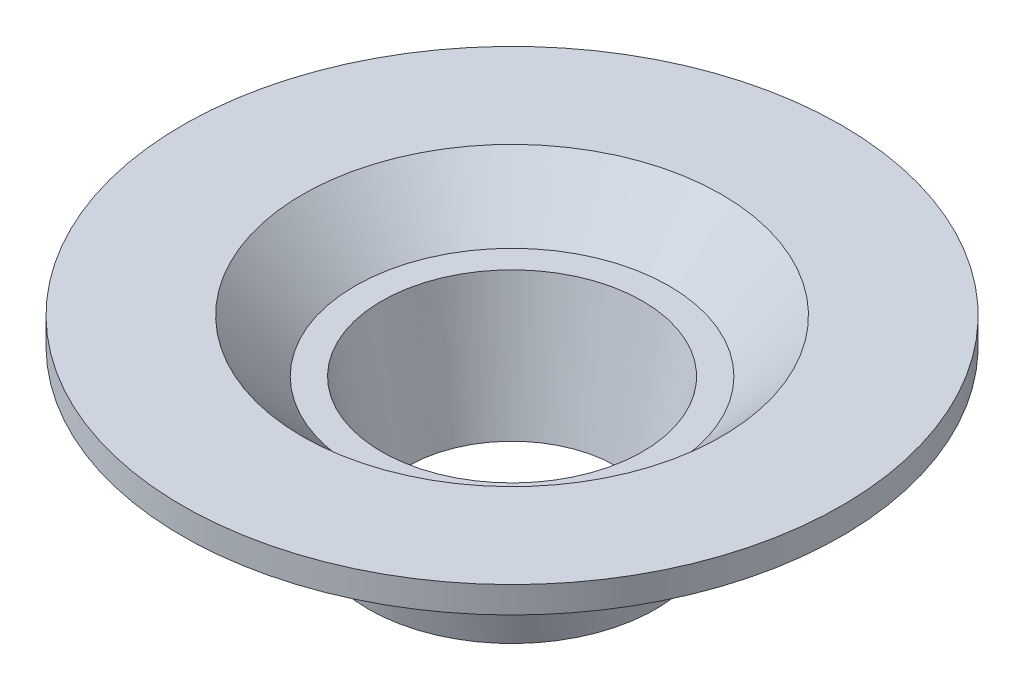
ISO-10303-21;
HEADER;
FILE_DESCRIPTION(('STEP AP214'),'2;1');
FILE_NAME('part.step','',(''),(''),'','','');
FILE_SCHEMA(('AUTOMOTIVE_DESIGN { 1 0 10303 214 1 1 1 1 }'));
ENDSEC;
DATA;
#1=APPLICATION_CONTEXT('core data for automotive mechanical design processes');
#2=APPLICATION_PROTOCOL_DEFINITION('international standard','automotive_design',2000,#1);
#3=PRODUCT_CONTEXT('',#1,'mechanical');
#4=PRODUCT('Part','Part','',(#3));
#5=PRODUCT_RELATED_PRODUCT_CATEGORY('part','',(#4));
#6=PRODUCT_DEFINITION_FORMATION('','',#4);
#7=PRODUCT_DEFINITION_CONTEXT('part definition',#1,'design');
#8=PRODUCT_DEFINITION('design','',#6,#7);
#9=PRODUCT_DEFINITION_SHAPE('','',#8);
#10=(LENGTH_UNIT() NAMED_UNIT(*) SI_UNIT(.MILLI.,.METRE.));
#11=(NAMED_UNIT(*) PLANE_ANGLE_UNIT() SI_UNIT($,.RADIAN.));
#12=(NAMED_UNIT(*) SI_UNIT($,.STERADIAN.) SOLID_ANGLE_UNIT());
#13=UNCERTAINTY_MEASURE_WITH_UNIT(LENGTH_MEASURE(1.E-05),#10,'distance_accuracy_value','');
#14=(GEOMETRIC_REPRESENTATION_CONTEXT(3) GLOBAL_UNCERTAINTY_ASSIGNED_CONTEXT((#13)) GLOBAL_UNIT_ASSIGNED_CONTEXT((#10,
#11,#12)) REPRESENTATION_CONTEXT('',''));
#15=CARTESIAN_POINT('',(0.,0.,0.));
#16=DIRECTION('',(0.,0.,1.));
#17=DIRECTION('',(1.,0.,0.));
#18=AXIS2_PLACEMENT_3D('',#15,#16,#17);
#19=CARTESIAN_POINT('',(0.,0.,0.));
#20=DIRECTION('',(0.,1.,0.));
#21=DIRECTION('',(0.,0.,1.));
#22=AXIS2_PLACEMENT_3D('',#19,#20,#21);
#23=CONICAL_SURFACE('',#22,4.95,0.200436328129634);
#24=CARTESIAN_POINT('',(0.,-4.92212380206688,0.));
#25=DIRECTION('',(0.,-1.,0.));
#26=DIRECTION('',(0.,0.,-1.));
#27=AXIS2_PLACEMENT_3D('',#24,#25,#26);
#28=CIRCLE('',#27,3.95);
#29=CARTESIAN_POINT('',(0.,-4.92212380206688,-3.95));
#30=VERTEX_POINT('',#29);
#31=EDGE_CURVE('E10',#30,#30,#28,.T.);
#32=ORIENTED_EDGE('',*,*,#31,.T.);
#33=EDGE_LOOP('',(#32));
#34=FACE_BOUND('',#33,.T.);
#35=CARTESIAN_POINT('',(0.,0.,0.));
#36=DIRECTION('',(0.,-1.,0.));
#37=DIRECTION('',(0.,0.,-1.));
#38=AXIS2_PLACEMENT_3D('',#35,#36,#37);
#39=CIRCLE('',#38,4.95);
#40=CARTESIAN_POINT('',(0.,0.,-4.95));
#41=VERTEX_POINT('',#40);
#42=EDGE_CURVE('E71',#41,#41,#39,.T.);
#43=ORIENTED_EDGE('',*,*,#42,.F.);
#44=EDGE_LOOP('',(#43));
#45=FACE_BOUND('',#44,.T.);
#46=ADVANCED_FACE('F40',(#34,#45),#23,.F.);
#47=CARTESIAN_POINT('',(3.95,-4.92212380206688,0.));
#48=DIRECTION('',(0.,-1.,0.));
#49=DIRECTION('',(0.,0.,-1.));
#50=AXIS2_PLACEMENT_3D('',#47,#48,#49);
#51=PLANE('',#50);
#52=CARTESIAN_POINT('',(0.,-4.92212380206688,0.));
#53=DIRECTION('',(0.,-1.,0.));
#54=DIRECTION('',(0.,0.,-1.));
#55=AXIS2_PLACEMENT_3D('',#52,#53,#54);
#56=CIRCLE('',#55,5.45);
#57=CARTESIAN_POINT('',(0.,-4.92212380206688,-5.45));
#58=VERTEX_POINT('',#57);
#59=EDGE_CURVE('E43',#58,#58,#56,.T.);
#60=ORIENTED_EDGE('',*,*,#59,.T.);
#61=EDGE_LOOP('',(#60));
#62=FACE_BOUND('',#61,.T.);
#63=ORIENTED_EDGE('',*,*,#31,.F.);
#64=EDGE_LOOP('',(#63));
#65=FACE_BOUND('',#64,.T.);
#66=ADVANCED_FACE('F80',(#62,#65),#51,.T.);
#67=CARTESIAN_POINT('',(0.,-4.92212380206688,0.));
#68=DIRECTION('',(0.,1.,0.));
#69=DIRECTION('',(0.,0.,1.));
#70=AXIS2_PLACEMENT_3D('',#67,#68,#69);
#71=CONICAL_SURFACE('',#70,5.45,0.197395559849881);
#72=CARTESIAN_POINT('',(0.,-0.922123802066883,0.));
#73=DIRECTION('',(0.,-1.,0.));
#74=DIRECTION('',(0.,0.,-1.));
#75=AXIS2_PLACEMENT_3D('',#72,#73,#74);
#76=CIRCLE('',#75,6.25);
#77=CARTESIAN_POINT('',(0.,-0.922123802066883,-6.25));
#78=VERTEX_POINT('',#77);
#79=EDGE_CURVE('E50',#78,#78,#76,.T.);
#80=ORIENTED_EDGE('',*,*,#79,.T.);
#81=EDGE_LOOP('',(#80));
#82=FACE_BOUND('',#81,.T.);
#83=ORIENTED_EDGE('',*,*,#59,.F.);
#84=EDGE_LOOP('',(#83));
#85=FACE_BOUND('',#84,.T.);
#86=ADVANCED_FACE('F81',(#82,#85),#71,.T.);
#87=CARTESIAN_POINT('',(8.57787619793312,-0.922123802066883,0.));
#88=DIRECTION('',(0.,-1.,0.));
#89=DIRECTION('',(0.,0.,-1.));
#90=AXIS2_PLACEMENT_3D('',#87,#88,#89);
#91=PLANE('',#90);
#92=CARTESIAN_POINT('',(0.,-0.922123802066884,0.));
#93=DIRECTION('',(0.,-1.,0.));
#94=DIRECTION('',(0.,0.,-1.));
#95=AXIS2_PLACEMENT_3D('',#92,#93,#94);
#96=CIRCLE('',#95,8.57787619793312);
#97=CARTESIAN_POINT('',(0.,-0.922123802066884,-8.57787619793312));
#98=VERTEX_POINT('',#97);
#99=EDGE_CURVE('E51',#98,#98,#96,.T.);
#100=ORIENTED_EDGE('',*,*,#99,.T.);
#101=EDGE_LOOP('',(#100));
#102=FACE_BOUND('',#101,.T.);
#103=ORIENTED_EDGE('',*,*,#79,.F.);
#104=EDGE_LOOP('',(#103));
#105=FACE_BOUND('',#104,.T.);
#106=ADVANCED_FACE('F90',(#102,#105),#91,.T.);
#107=CARTESIAN_POINT('',(0.,-0.922123802066884,0.));
#108=DIRECTION('',(0.,1.,0.));
#109=DIRECTION('',(0.,0.,1.));
#110=AXIS2_PLACEMENT_3D('',#107,#108,#109);
#111=CONICAL_SURFACE('',#110,8.57787619793312,0.785398163397447);
#112=CARTESIAN_POINT('',(0.,1.,0.));
#113=DIRECTION('',(0.,-1.,0.));
#114=DIRECTION('',(0.,0.,-1.));
#115=AXIS2_PLACEMENT_3D('',#112,#113,#114);
#116=CIRCLE('',#115,10.5);
#117=CARTESIAN_POINT('',(0.,1.,-10.5));
#118=VERTEX_POINT('',#117);
#119=EDGE_CURVE('E57',#118,#118,#116,.T.);
#120=ORIENTED_EDGE('',*,*,#119,.T.);
#121=EDGE_LOOP('',(#120));
#122=FACE_BOUND('',#121,.T.);
#123=ORIENTED_EDGE('',*,*,#99,.F.);
#124=EDGE_LOOP('',(#123));
#125=FACE_BOUND('',#124,.T.);
#126=ADVANCED_FACE('F92',(#122,#125),#111,.T.);
#127=CARTESIAN_POINT('',(12.5,1.,0.));
#128=DIRECTION('',(0.,-1.,0.));
#129=DIRECTION('',(0.,0.,-1.));
#130=AXIS2_PLACEMENT_3D('',#127,#128,#129);
#131=PLANE('',#130);
#132=CARTESIAN_POINT('',(0.,1.,0.));
#133=DIRECTION('',(0.,-1.,0.));
#134=DIRECTION('',(0.,0.,-1.));
#135=AXIS2_PLACEMENT_3D('',#132,#133,#134);
#136=CIRCLE('',#135,12.5);
#137=CARTESIAN_POINT('',(0.,1.,-12.5));
#138=VERTEX_POINT('',#137);
#139=EDGE_CURVE('E56',#138,#138,#136,.T.);
#140=ORIENTED_EDGE('',*,*,#139,.T.);
#141=EDGE_LOOP('',(#140));
#142=FACE_BOUND('',#141,.T.);
#143=ORIENTED_EDGE('',*,*,#119,.F.);
#144=EDGE_LOOP('',(#143));
#145=FACE_BOUND('',#144,.T.);
#146=ADVANCED_FACE('F97',(#142,#145),#131,.T.);
#147=CARTESIAN_POINT('',(0.,-4.92212380206688,0.));
#148=DIRECTION('',(0.,-1.,0.));
#149=DIRECTION('',(0.,0.,-1.));
#150=AXIS2_PLACEMENT_3D('',#147,#148,#149);
#151=CYLINDRICAL_SURFACE('',#150,12.5);
#152=CARTESIAN_POINT('',(0.,2.,0.));
#153=DIRECTION('',(0.,-1.,0.));
#154=DIRECTION('',(0.,0.,-1.));
#155=AXIS2_PLACEMENT_3D('',#152,#153,#154);
#156=CIRCLE('',#155,12.5);
#157=CARTESIAN_POINT('',(0.,2.,-12.5));
#158=VERTEX_POINT('',#157);
#159=EDGE_CURVE('E62',#158,#158,#156,.T.);
#160=ORIENTED_EDGE('',*,*,#159,.T.);
#161=EDGE_LOOP('',(#160));
#162=FACE_BOUND('',#161,.T.);
#163=ORIENTED_EDGE('',*,*,#139,.F.);
#164=EDGE_LOOP('',(#163));
#165=FACE_BOUND('',#164,.T.);
#166=ADVANCED_FACE('F105',(#162,#165),#151,.T.);
#167=CARTESIAN_POINT('',(7.95,2.,0.));
#168=DIRECTION('',(0.,1.,0.));
#169=DIRECTION('',(0.,0.,1.));
#170=AXIS2_PLACEMENT_3D('',#167,#168,#169);
#171=PLANE('',#170);
#172=CARTESIAN_POINT('',(0.,2.,0.));
#173=DIRECTION('',(0.,-1.,0.));
#174=DIRECTION('',(0.,0.,-1.));
#175=AXIS2_PLACEMENT_3D('',#172,#173,#174);
#176=CIRCLE('',#175,7.95);
#177=CARTESIAN_POINT('',(0.,2.,-7.95));
#178=VERTEX_POINT('',#177);
#179=EDGE_CURVE('E65',#178,#178,#176,.T.);
#180=ORIENTED_EDGE('',*,*,#179,.T.);
#181=EDGE_LOOP('',(#180));
#182=FACE_BOUND('',#181,.T.);
#183=ORIENTED_EDGE('',*,*,#159,.F.);
#184=EDGE_LOOP('',(#183));
#185=FACE_BOUND('',#184,.T.);
#186=ADVANCED_FACE('F106',(#182,#185),#171,.T.);
#187=CARTESIAN_POINT('',(0.,2.,0.));
#188=DIRECTION('',(0.,1.,0.));
#189=DIRECTION('',(0.,0.,1.));
#190=AXIS2_PLACEMENT_3D('',#187,#188,#189);
#191=CONICAL_SURFACE('',#190,7.95,0.785398163397448);
#192=CARTESIAN_POINT('',(0.,0.,0.));
#193=DIRECTION('',(0.,-1.,0.));
#194=DIRECTION('',(0.,0.,-1.));
#195=AXIS2_PLACEMENT_3D('',#192,#193,#194);
#196=CIRCLE('',#195,5.95);
#197=CARTESIAN_POINT('',(0.,0.,-5.95));
#198=VERTEX_POINT('',#197);
#199=EDGE_CURVE('E66',#198,#198,#196,.T.);
#200=ORIENTED_EDGE('',*,*,#199,.T.);
#201=EDGE_LOOP('',(#200));
#202=FACE_BOUND('',#201,.T.);
#203=ORIENTED_EDGE('',*,*,#179,.F.);
#204=EDGE_LOOP('',(#203));
#205=FACE_BOUND('',#204,.T.);
#206=ADVANCED_FACE('F110',(#202,#205),#191,.F.);
#207=CARTESIAN_POINT('',(4.95,0.,0.));
#208=DIRECTION('',(0.,1.,0.));
#209=DIRECTION('',(0.,0.,1.));
#210=AXIS2_PLACEMENT_3D('',#207,#208,#209);
#211=PLANE('',#210);
#212=ORIENTED_EDGE('',*,*,#42,.T.);
#213=EDGE_LOOP('',(#212));
#214=FACE_BOUND('',#213,.T.);
#215=ORIENTED_EDGE('',*,*,#199,.F.);
#216=EDGE_LOOP('',(#215));
#217=FACE_BOUND('',#216,.T.);
#218=ADVANCED_FACE('F75',(#214,#217),#211,.T.);
#219=CLOSED_SHELL('',(#46,#66,#86,#106,#126,#146,#166,#186,#206,#218));
#220=MANIFOLD_SOLID_BREP('B2',#219);
#221=ADVANCED_BREP_SHAPE_REPRESENTATION('',(#18,#220),#14);
#222=SHAPE_DEFINITION_REPRESENTATION(#9,#221);
ENDSEC;
END-ISO-10303-21;
